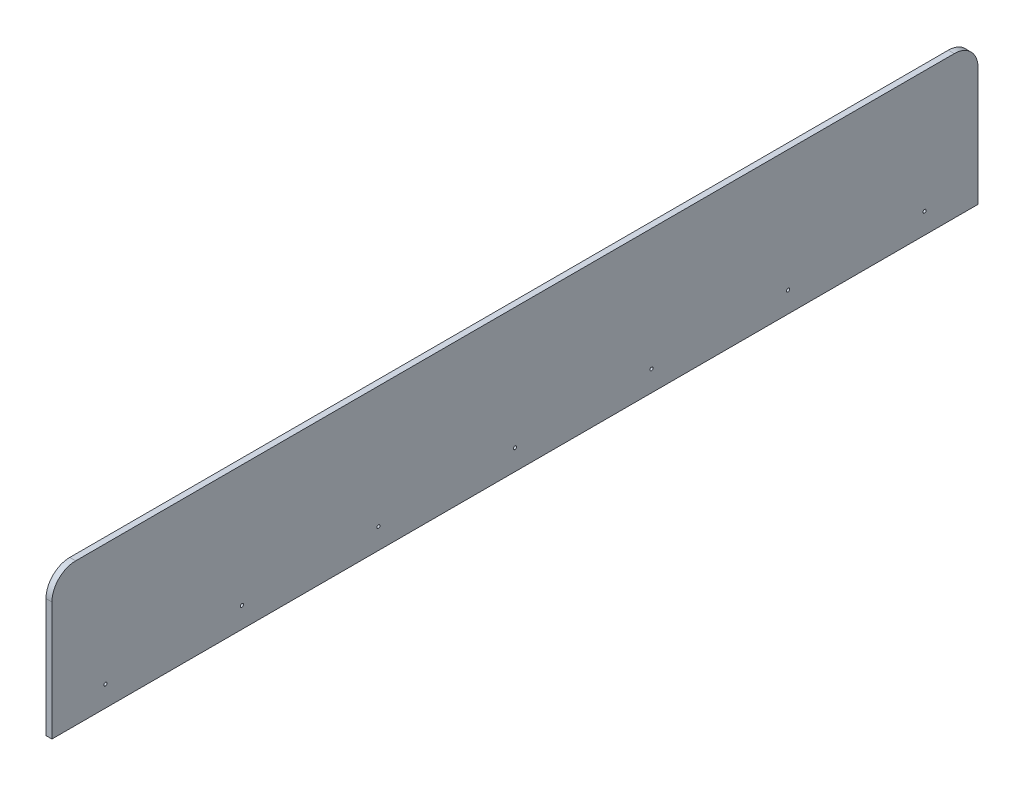
ISO-10303-21;
HEADER;
FILE_DESCRIPTION(('STEP AP214'),'2;1');
FILE_NAME('part.step','',(''),(''),'','','');
FILE_SCHEMA(('AUTOMOTIVE_DESIGN { 1 0 10303 214 1 1 1 1 }'));
ENDSEC;
DATA;
#1=APPLICATION_CONTEXT('core data for automotive mechanical design processes');
#2=APPLICATION_PROTOCOL_DEFINITION('international standard','automotive_design',2000,#1);
#3=PRODUCT_CONTEXT('',#1,'mechanical');
#4=PRODUCT('Part','Part','',(#3));
#5=PRODUCT_RELATED_PRODUCT_CATEGORY('part','',(#4));
#6=PRODUCT_DEFINITION_FORMATION('','',#4);
#7=PRODUCT_DEFINITION_CONTEXT('part definition',#1,'design');
#8=PRODUCT_DEFINITION('design','',#6,#7);
#9=PRODUCT_DEFINITION_SHAPE('','',#8);
#10=(LENGTH_UNIT() NAMED_UNIT(*) SI_UNIT(.MILLI.,.METRE.));
#11=(NAMED_UNIT(*) PLANE_ANGLE_UNIT() SI_UNIT($,.RADIAN.));
#12=(NAMED_UNIT(*) SI_UNIT($,.STERADIAN.) SOLID_ANGLE_UNIT());
#13=UNCERTAINTY_MEASURE_WITH_UNIT(LENGTH_MEASURE(1.E-05),#10,'distance_accuracy_value','');
#14=(GEOMETRIC_REPRESENTATION_CONTEXT(3) GLOBAL_UNCERTAINTY_ASSIGNED_CONTEXT((#13)) GLOBAL_UNIT_ASSIGNED_CONTEXT((#10,
#11,#12)) REPRESENTATION_CONTEXT('',''));
#15=CARTESIAN_POINT('',(0.,0.,0.));
#16=DIRECTION('',(0.,0.,1.));
#17=DIRECTION('',(1.,0.,0.));
#18=AXIS2_PLACEMENT_3D('',#15,#16,#17);
#19=CARTESIAN_POINT('',(12.7,101.6,939.8));
#20=DIRECTION('',(1.,0.,0.));
#21=DIRECTION('',(0.,0.,-1.));
#22=AXIS2_PLACEMENT_3D('',#19,#20,#21);
#23=PLANE('',#22);
#24=CARTESIAN_POINT('',(12.7,-107.95,-584.2));
#25=DIRECTION('',(1.,0.,0.));
#26=DIRECTION('',(0.,0.,-1.));
#27=AXIS2_PLACEMENT_3D('',#24,#25,#26);
#28=CIRCLE('',#27,3.37343749999992);
#29=CARTESIAN_POINT('',(12.7,-107.95,-587.5734375));
#30=VERTEX_POINT('',#29);
#31=EDGE_CURVE('E209',#30,#30,#28,.T.);
#32=ORIENTED_EDGE('',*,*,#31,.F.);
#33=EDGE_LOOP('',(#32));
#34=FACE_BOUND('',#33,.T.);
#35=CARTESIAN_POINT('',(12.7,-107.95,1.11022302462516E-13));
#36=DIRECTION('',(1.,0.,0.));
#37=DIRECTION('',(0.,0.,-1.));
#38=AXIS2_PLACEMENT_3D('',#35,#36,#37);
#39=CIRCLE('',#38,3.37343749999992);
#40=CARTESIAN_POINT('',(12.7,-107.95,-3.37343749999981));
#41=VERTEX_POINT('',#40);
#42=EDGE_CURVE('E221',#41,#41,#39,.T.);
#43=ORIENTED_EDGE('',*,*,#42,.F.);
#44=EDGE_LOOP('',(#43));
#45=FACE_BOUND('',#44,.T.);
#46=CARTESIAN_POINT('',(12.7,-107.95,584.2));
#47=DIRECTION('',(1.,0.,0.));
#48=DIRECTION('',(0.,0.,-1.));
#49=AXIS2_PLACEMENT_3D('',#46,#47,#48);
#50=CIRCLE('',#49,3.37343749999992);
#51=CARTESIAN_POINT('',(12.7,-107.95,580.8265625));
#52=VERTEX_POINT('',#51);
#53=EDGE_CURVE('E233',#52,#52,#50,.T.);
#54=ORIENTED_EDGE('',*,*,#53,.F.);
#55=EDGE_LOOP('',(#54));
#56=FACE_BOUND('',#55,.T.);
#57=DIRECTION('',(0.,-1.,0.));
#58=VECTOR('',#57,1.);
#59=CARTESIAN_POINT('',(12.7,-152.4,990.6));
#60=LINE('',#59,#58);
#61=CARTESIAN_POINT('',(12.7,101.6,990.6));
#62=VERTEX_POINT('',#61);
#63=CARTESIAN_POINT('',(12.7,-152.4,990.6));
#64=VERTEX_POINT('',#63);
#65=EDGE_CURVE('E137',#62,#64,#60,.T.);
#66=ORIENTED_EDGE('',*,*,#65,.T.);
#67=DIRECTION('',(0.,0.,-1.));
#68=VECTOR('',#67,1.);
#69=CARTESIAN_POINT('',(12.7,-152.4,990.6));
#70=LINE('',#69,#68);
#71=CARTESIAN_POINT('',(12.7,-152.4,-990.6));
#72=VERTEX_POINT('',#71);
#73=EDGE_CURVE('E95',#64,#72,#70,.T.);
#74=ORIENTED_EDGE('',*,*,#73,.T.);
#75=DIRECTION('',(0.,1.,0.));
#76=VECTOR('',#75,1.);
#77=CARTESIAN_POINT('',(12.7,-152.4,-990.6));
#78=LINE('',#77,#76);
#79=CARTESIAN_POINT('',(12.7,101.6,-990.6));
#80=VERTEX_POINT('',#79);
#81=EDGE_CURVE('E108',#72,#80,#78,.T.);
#82=ORIENTED_EDGE('',*,*,#81,.T.);
#83=CARTESIAN_POINT('',(12.7,101.6,-939.799999999999));
#84=DIRECTION('',(1.,0.,0.));
#85=DIRECTION('',(0.,0.,1.));
#86=AXIS2_PLACEMENT_3D('',#83,#84,#85);
#87=CIRCLE('',#86,50.8);
#88=CARTESIAN_POINT('',(12.7,152.4,-939.799999999999));
#89=VERTEX_POINT('',#88);
#90=EDGE_CURVE('E102',#80,#89,#87,.T.);
#91=ORIENTED_EDGE('',*,*,#90,.T.);
#92=DIRECTION('',(0.,0.,1.));
#93=VECTOR('',#92,1.);
#94=CARTESIAN_POINT('',(12.7,152.4,939.799999999999));
#95=LINE('',#94,#93);
#96=CARTESIAN_POINT('',(12.7,152.4,939.799999999999));
#97=VERTEX_POINT('',#96);
#98=EDGE_CURVE('E106',#89,#97,#95,.T.);
#99=ORIENTED_EDGE('',*,*,#98,.T.);
#100=CARTESIAN_POINT('',(12.7,101.6,939.8));
#101=DIRECTION('',(1.,0.,0.));
#102=DIRECTION('',(0.,0.,-1.));
#103=AXIS2_PLACEMENT_3D('',#100,#101,#102);
#104=CIRCLE('',#103,50.8);
#105=EDGE_CURVE('E58',#97,#62,#104,.T.);
#106=ORIENTED_EDGE('',*,*,#105,.T.);
#107=EDGE_LOOP('',(#66,#74,#82,#91,#99,#106));
#108=FACE_BOUND('',#107,.T.);
#109=CARTESIAN_POINT('',(12.7,-107.95,876.3));
#110=DIRECTION('',(1.,0.,0.));
#111=DIRECTION('',(0.,0.,-1.));
#112=AXIS2_PLACEMENT_3D('',#109,#110,#111);
#113=CIRCLE('',#112,3.37343749999992);
#114=CARTESIAN_POINT('',(12.7,-107.95,872.9265625));
#115=VERTEX_POINT('',#114);
#116=EDGE_CURVE('E130',#115,#115,#113,.T.);
#117=ORIENTED_EDGE('',*,*,#116,.F.);
#118=EDGE_LOOP('',(#117));
#119=FACE_BOUND('',#118,.T.);
#120=CARTESIAN_POINT('',(12.7,-107.95,292.1));
#121=DIRECTION('',(1.,0.,0.));
#122=DIRECTION('',(0.,0.,-1.));
#123=AXIS2_PLACEMENT_3D('',#120,#121,#122);
#124=CIRCLE('',#123,3.37343749999992);
#125=CARTESIAN_POINT('',(12.7,-107.95,288.7265625));
#126=VERTEX_POINT('',#125);
#127=EDGE_CURVE('E227',#126,#126,#124,.T.);
#128=ORIENTED_EDGE('',*,*,#127,.F.);
#129=EDGE_LOOP('',(#128));
#130=FACE_BOUND('',#129,.T.);
#131=CARTESIAN_POINT('',(12.7,-107.95,-292.1));
#132=DIRECTION('',(1.,0.,0.));
#133=DIRECTION('',(0.,0.,-1.));
#134=AXIS2_PLACEMENT_3D('',#131,#132,#133);
#135=CIRCLE('',#134,3.37343749999992);
#136=CARTESIAN_POINT('',(12.7,-107.95,-295.4734375));
#137=VERTEX_POINT('',#136);
#138=EDGE_CURVE('E215',#137,#137,#135,.T.);
#139=ORIENTED_EDGE('',*,*,#138,.F.);
#140=EDGE_LOOP('',(#139));
#141=FACE_BOUND('',#140,.T.);
#142=CARTESIAN_POINT('',(12.7,-107.95,-876.3));
#143=DIRECTION('',(1.,0.,0.));
#144=DIRECTION('',(0.,0.,-1.));
#145=AXIS2_PLACEMENT_3D('',#142,#143,#144);
#146=CIRCLE('',#145,3.37343749999992);
#147=CARTESIAN_POINT('',(12.7,-107.95,-879.6734375));
#148=VERTEX_POINT('',#147);
#149=EDGE_CURVE('E200',#148,#148,#146,.T.);
#150=ORIENTED_EDGE('',*,*,#149,.F.);
#151=EDGE_LOOP('',(#150));
#152=FACE_BOUND('',#151,.T.);
#153=ADVANCED_FACE('F41',(#34,#45,#56,#108,#119,#130,#141,#152),#23,.T.);
#154=CARTESIAN_POINT('',(0.,101.6,939.8));
#155=DIRECTION('',(1.,0.,0.));
#156=DIRECTION('',(0.,0.,-1.));
#157=AXIS2_PLACEMENT_3D('',#154,#155,#156);
#158=PLANE('',#157);
#159=DIRECTION('',(0.,-1.,0.));
#160=VECTOR('',#159,1.);
#161=CARTESIAN_POINT('',(0.,-152.4,990.6));
#162=LINE('',#161,#160);
#163=CARTESIAN_POINT('',(0.,101.6,990.6));
#164=VERTEX_POINT('',#163);
#165=CARTESIAN_POINT('',(0.,-152.4,990.6));
#166=VERTEX_POINT('',#165);
#167=EDGE_CURVE('E126',#164,#166,#162,.T.);
#168=ORIENTED_EDGE('',*,*,#167,.F.);
#169=CARTESIAN_POINT('',(0.,101.6,939.8));
#170=DIRECTION('',(1.,0.,0.));
#171=DIRECTION('',(0.,0.,-1.));
#172=AXIS2_PLACEMENT_3D('',#169,#170,#171);
#173=CIRCLE('',#172,50.8);
#174=CARTESIAN_POINT('',(0.,152.4,939.799999999999));
#175=VERTEX_POINT('',#174);
#176=EDGE_CURVE('E87',#175,#164,#173,.T.);
#177=ORIENTED_EDGE('',*,*,#176,.F.);
#178=DIRECTION('',(0.,0.,1.));
#179=VECTOR('',#178,1.);
#180=CARTESIAN_POINT('',(0.,152.4,939.799999999999));
#181=LINE('',#180,#179);
#182=CARTESIAN_POINT('',(0.,152.4,-939.799999999999));
#183=VERTEX_POINT('',#182);
#184=EDGE_CURVE('E81',#183,#175,#181,.T.);
#185=ORIENTED_EDGE('',*,*,#184,.F.);
#186=CARTESIAN_POINT('',(0.,101.6,-939.799999999999));
#187=DIRECTION('',(1.,0.,0.));
#188=DIRECTION('',(0.,0.,1.));
#189=AXIS2_PLACEMENT_3D('',#186,#187,#188);
#190=CIRCLE('',#189,50.8);
#191=CARTESIAN_POINT('',(0.,101.6,-990.6));
#192=VERTEX_POINT('',#191);
#193=EDGE_CURVE('E116',#192,#183,#190,.T.);
#194=ORIENTED_EDGE('',*,*,#193,.F.);
#195=DIRECTION('',(0.,1.,0.));
#196=VECTOR('',#195,1.);
#197=CARTESIAN_POINT('',(0.,-152.4,-990.6));
#198=LINE('',#197,#196);
#199=CARTESIAN_POINT('',(0.,-152.4,-990.6));
#200=VERTEX_POINT('',#199);
#201=EDGE_CURVE('E132',#200,#192,#198,.T.);
#202=ORIENTED_EDGE('',*,*,#201,.F.);
#203=DIRECTION('',(0.,0.,-1.));
#204=VECTOR('',#203,1.);
#205=CARTESIAN_POINT('',(0.,-152.4,990.6));
#206=LINE('',#205,#204);
#207=EDGE_CURVE('E129',#166,#200,#206,.T.);
#208=ORIENTED_EDGE('',*,*,#207,.F.);
#209=EDGE_LOOP('',(#168,#177,#185,#194,#202,#208));
#210=FACE_BOUND('',#209,.T.);
#211=CARTESIAN_POINT('',(0.,-107.95,876.3));
#212=DIRECTION('',(1.,0.,0.));
#213=DIRECTION('',(0.,0.,-1.));
#214=AXIS2_PLACEMENT_3D('',#211,#212,#213);
#215=CIRCLE('',#214,3.37343749999992);
#216=CARTESIAN_POINT('',(0.,-107.95,872.9265625));
#217=VERTEX_POINT('',#216);
#218=EDGE_CURVE('E236',#217,#217,#215,.T.);
#219=ORIENTED_EDGE('',*,*,#218,.T.);
#220=EDGE_LOOP('',(#219));
#221=FACE_BOUND('',#220,.T.);
#222=CARTESIAN_POINT('',(0.,-107.95,584.2));
#223=DIRECTION('',(1.,0.,0.));
#224=DIRECTION('',(0.,0.,-1.));
#225=AXIS2_PLACEMENT_3D('',#222,#223,#224);
#226=CIRCLE('',#225,3.37343749999992);
#227=CARTESIAN_POINT('',(0.,-107.95,580.8265625));
#228=VERTEX_POINT('',#227);
#229=EDGE_CURVE('E230',#228,#228,#226,.T.);
#230=ORIENTED_EDGE('',*,*,#229,.T.);
#231=EDGE_LOOP('',(#230));
#232=FACE_BOUND('',#231,.T.);
#233=CARTESIAN_POINT('',(0.,-107.95,292.1));
#234=DIRECTION('',(1.,0.,0.));
#235=DIRECTION('',(0.,0.,-1.));
#236=AXIS2_PLACEMENT_3D('',#233,#234,#235);
#237=CIRCLE('',#236,3.37343749999992);
#238=CARTESIAN_POINT('',(0.,-107.95,288.7265625));
#239=VERTEX_POINT('',#238);
#240=EDGE_CURVE('E224',#239,#239,#237,.T.);
#241=ORIENTED_EDGE('',*,*,#240,.T.);
#242=EDGE_LOOP('',(#241));
#243=FACE_BOUND('',#242,.T.);
#244=CARTESIAN_POINT('',(0.,-107.95,1.11022302462516E-13));
#245=DIRECTION('',(1.,0.,0.));
#246=DIRECTION('',(0.,0.,-1.));
#247=AXIS2_PLACEMENT_3D('',#244,#245,#246);
#248=CIRCLE('',#247,3.37343749999992);
#249=CARTESIAN_POINT('',(0.,-107.95,-3.37343749999981));
#250=VERTEX_POINT('',#249);
#251=EDGE_CURVE('E218',#250,#250,#248,.T.);
#252=ORIENTED_EDGE('',*,*,#251,.T.);
#253=EDGE_LOOP('',(#252));
#254=FACE_BOUND('',#253,.T.);
#255=CARTESIAN_POINT('',(0.,-107.95,-292.1));
#256=DIRECTION('',(1.,0.,0.));
#257=DIRECTION('',(0.,0.,-1.));
#258=AXIS2_PLACEMENT_3D('',#255,#256,#257);
#259=CIRCLE('',#258,3.37343749999992);
#260=CARTESIAN_POINT('',(0.,-107.95,-295.4734375));
#261=VERTEX_POINT('',#260);
#262=EDGE_CURVE('E212',#261,#261,#259,.T.);
#263=ORIENTED_EDGE('',*,*,#262,.T.);
#264=EDGE_LOOP('',(#263));
#265=FACE_BOUND('',#264,.T.);
#266=CARTESIAN_POINT('',(0.,-107.95,-584.2));
#267=DIRECTION('',(1.,0.,0.));
#268=DIRECTION('',(0.,0.,-1.));
#269=AXIS2_PLACEMENT_3D('',#266,#267,#268);
#270=CIRCLE('',#269,3.37343749999992);
#271=CARTESIAN_POINT('',(0.,-107.95,-587.5734375));
#272=VERTEX_POINT('',#271);
#273=EDGE_CURVE('E206',#272,#272,#270,.T.);
#274=ORIENTED_EDGE('',*,*,#273,.T.);
#275=EDGE_LOOP('',(#274));
#276=FACE_BOUND('',#275,.T.);
#277=CARTESIAN_POINT('',(0.,-107.95,-876.3));
#278=DIRECTION('',(1.,0.,0.));
#279=DIRECTION('',(0.,0.,-1.));
#280=AXIS2_PLACEMENT_3D('',#277,#278,#279);
#281=CIRCLE('',#280,3.37343749999992);
#282=CARTESIAN_POINT('',(0.,-107.95,-879.6734375));
#283=VERTEX_POINT('',#282);
#284=EDGE_CURVE('E203',#283,#283,#281,.T.);
#285=ORIENTED_EDGE('',*,*,#284,.T.);
#286=EDGE_LOOP('',(#285));
#287=FACE_BOUND('',#286,.T.);
#288=ADVANCED_FACE('F146',(#210,#221,#232,#243,#254,#265,#276,#287),#158,.F.);
#289=CARTESIAN_POINT('',(12.7,-152.4,990.6));
#290=DIRECTION('',(0.,0.,-1.));
#291=DIRECTION('',(-1.,0.,0.));
#292=AXIS2_PLACEMENT_3D('',#289,#290,#291);
#293=PLANE('',#292);
#294=ORIENTED_EDGE('',*,*,#167,.T.);
#295=DIRECTION('',(-1.,0.,0.));
#296=VECTOR('',#295,1.);
#297=CARTESIAN_POINT('',(12.7,-152.4,990.6));
#298=LINE('',#297,#296);
#299=EDGE_CURVE('E13',#64,#166,#298,.T.);
#300=ORIENTED_EDGE('',*,*,#299,.F.);
#301=ORIENTED_EDGE('',*,*,#65,.F.);
#302=DIRECTION('',(-1.,0.,0.));
#303=VECTOR('',#302,1.);
#304=CARTESIAN_POINT('',(12.7,101.6,990.6));
#305=LINE('',#304,#303);
#306=EDGE_CURVE('E122',#62,#164,#305,.T.);
#307=ORIENTED_EDGE('',*,*,#306,.T.);
#308=EDGE_LOOP('',(#294,#300,#301,#307));
#309=FACE_BOUND('',#308,.T.);
#310=ADVANCED_FACE('F43',(#309),#293,.F.);
#311=CARTESIAN_POINT('',(12.7,-152.4,990.6));
#312=DIRECTION('',(0.,1.,0.));
#313=DIRECTION('',(0.,0.,1.));
#314=AXIS2_PLACEMENT_3D('',#311,#312,#313);
#315=PLANE('',#314);
#316=ORIENTED_EDGE('',*,*,#207,.T.);
#317=DIRECTION('',(-1.,0.,0.));
#318=VECTOR('',#317,1.);
#319=CARTESIAN_POINT('',(12.7,-152.4,-990.6));
#320=LINE('',#319,#318);
#321=EDGE_CURVE('E50',#72,#200,#320,.T.);
#322=ORIENTED_EDGE('',*,*,#321,.F.);
#323=ORIENTED_EDGE('',*,*,#73,.F.);
#324=ORIENTED_EDGE('',*,*,#299,.T.);
#325=EDGE_LOOP('',(#316,#322,#323,#324));
#326=FACE_BOUND('',#325,.T.);
#327=ADVANCED_FACE('F321',(#326),#315,.F.);
#328=CARTESIAN_POINT('',(12.7,-152.4,-990.6));
#329=DIRECTION('',(0.,0.,1.));
#330=DIRECTION('',(0.,-1.,0.));
#331=AXIS2_PLACEMENT_3D('',#328,#329,#330);
#332=PLANE('',#331);
#333=ORIENTED_EDGE('',*,*,#201,.T.);
#334=DIRECTION('',(-1.,0.,0.));
#335=VECTOR('',#334,1.);
#336=CARTESIAN_POINT('',(12.7,101.6,-990.6));
#337=LINE('',#336,#335);
#338=EDGE_CURVE('E117',#80,#192,#337,.T.);
#339=ORIENTED_EDGE('',*,*,#338,.F.);
#340=ORIENTED_EDGE('',*,*,#81,.F.);
#341=ORIENTED_EDGE('',*,*,#321,.T.);
#342=EDGE_LOOP('',(#333,#339,#340,#341));
#343=FACE_BOUND('',#342,.T.);
#344=ADVANCED_FACE('F143',(#343),#332,.F.);
#345=CARTESIAN_POINT('',(12.7,101.6,-939.799999999999));
#346=DIRECTION('',(-1.,0.,0.));
#347=DIRECTION('',(0.,0.,1.));
#348=AXIS2_PLACEMENT_3D('',#345,#346,#347);
#349=CYLINDRICAL_SURFACE('',#348,50.8);
#350=ORIENTED_EDGE('',*,*,#193,.T.);
#351=DIRECTION('',(-1.,0.,0.));
#352=VECTOR('',#351,1.);
#353=CARTESIAN_POINT('',(12.7,152.4,-939.799999999999));
#354=LINE('',#353,#352);
#355=EDGE_CURVE('E113',#89,#183,#354,.T.);
#356=ORIENTED_EDGE('',*,*,#355,.F.);
#357=ORIENTED_EDGE('',*,*,#90,.F.);
#358=ORIENTED_EDGE('',*,*,#338,.T.);
#359=EDGE_LOOP('',(#350,#356,#357,#358));
#360=FACE_BOUND('',#359,.T.);
#361=ADVANCED_FACE('F114',(#360),#349,.T.);
#362=CARTESIAN_POINT('',(12.7,152.4,939.799999999999));
#363=DIRECTION('',(0.,-1.,0.));
#364=DIRECTION('',(0.,0.,-1.));
#365=AXIS2_PLACEMENT_3D('',#362,#363,#364);
#366=PLANE('',#365);
#367=ORIENTED_EDGE('',*,*,#184,.T.);
#368=DIRECTION('',(-1.,0.,0.));
#369=VECTOR('',#368,1.);
#370=CARTESIAN_POINT('',(12.7,152.4,939.799999999999));
#371=LINE('',#370,#369);
#372=EDGE_CURVE('E118',#97,#175,#371,.T.);
#373=ORIENTED_EDGE('',*,*,#372,.F.);
#374=ORIENTED_EDGE('',*,*,#98,.F.);
#375=ORIENTED_EDGE('',*,*,#355,.T.);
#376=EDGE_LOOP('',(#367,#373,#374,#375));
#377=FACE_BOUND('',#376,.T.);
#378=ADVANCED_FACE('F120',(#377),#366,.F.);
#379=CARTESIAN_POINT('',(12.7,101.6,939.8));
#380=DIRECTION('',(-1.,0.,0.));
#381=DIRECTION('',(0.,0.,1.));
#382=AXIS2_PLACEMENT_3D('',#379,#380,#381);
#383=CYLINDRICAL_SURFACE('',#382,50.8);
#384=ORIENTED_EDGE('',*,*,#176,.T.);
#385=ORIENTED_EDGE('',*,*,#306,.F.);
#386=ORIENTED_EDGE('',*,*,#105,.F.);
#387=ORIENTED_EDGE('',*,*,#372,.T.);
#388=EDGE_LOOP('',(#384,#385,#386,#387));
#389=FACE_BOUND('',#388,.T.);
#390=ADVANCED_FACE('F151',(#389),#383,.T.);
#391=CARTESIAN_POINT('',(12.7,-107.95,876.3));
#392=DIRECTION('',(-1.,0.,0.));
#393=DIRECTION('',(0.,0.,1.));
#394=AXIS2_PLACEMENT_3D('',#391,#392,#393);
#395=CYLINDRICAL_SURFACE('',#394,3.37343749999992);
#396=ORIENTED_EDGE('',*,*,#116,.T.);
#397=EDGE_LOOP('',(#396));
#398=FACE_BOUND('',#397,.T.);
#399=ORIENTED_EDGE('',*,*,#218,.F.);
#400=EDGE_LOOP('',(#399));
#401=FACE_BOUND('',#400,.T.);
#402=ADVANCED_FACE('F153',(#398,#401),#395,.F.);
#403=CARTESIAN_POINT('',(12.7,-107.95,584.2));
#404=DIRECTION('',(-1.,0.,0.));
#405=DIRECTION('',(0.,0.,1.));
#406=AXIS2_PLACEMENT_3D('',#403,#404,#405);
#407=CYLINDRICAL_SURFACE('',#406,3.37343749999992);
#408=ORIENTED_EDGE('',*,*,#53,.T.);
#409=EDGE_LOOP('',(#408));
#410=FACE_BOUND('',#409,.T.);
#411=ORIENTED_EDGE('',*,*,#229,.F.);
#412=EDGE_LOOP('',(#411));
#413=FACE_BOUND('',#412,.T.);
#414=ADVANCED_FACE('F159',(#410,#413),#407,.F.);
#415=CARTESIAN_POINT('',(12.7,-107.95,292.1));
#416=DIRECTION('',(-1.,0.,0.));
#417=DIRECTION('',(0.,0.,1.));
#418=AXIS2_PLACEMENT_3D('',#415,#416,#417);
#419=CYLINDRICAL_SURFACE('',#418,3.37343749999992);
#420=ORIENTED_EDGE('',*,*,#127,.T.);
#421=EDGE_LOOP('',(#420));
#422=FACE_BOUND('',#421,.T.);
#423=ORIENTED_EDGE('',*,*,#240,.F.);
#424=EDGE_LOOP('',(#423));
#425=FACE_BOUND('',#424,.T.);
#426=ADVANCED_FACE('F175',(#422,#425),#419,.F.);
#427=CARTESIAN_POINT('',(12.7,-107.95,1.11022302462516E-13));
#428=DIRECTION('',(-1.,0.,0.));
#429=DIRECTION('',(0.,0.,1.));
#430=AXIS2_PLACEMENT_3D('',#427,#428,#429);
#431=CYLINDRICAL_SURFACE('',#430,3.37343749999992);
#432=ORIENTED_EDGE('',*,*,#42,.T.);
#433=EDGE_LOOP('',(#432));
#434=FACE_BOUND('',#433,.T.);
#435=ORIENTED_EDGE('',*,*,#251,.F.);
#436=EDGE_LOOP('',(#435));
#437=FACE_BOUND('',#436,.T.);
#438=ADVANCED_FACE('F179',(#434,#437),#431,.F.);
#439=CARTESIAN_POINT('',(12.7,-107.95,-292.1));
#440=DIRECTION('',(-1.,0.,0.));
#441=DIRECTION('',(0.,0.,1.));
#442=AXIS2_PLACEMENT_3D('',#439,#440,#441);
#443=CYLINDRICAL_SURFACE('',#442,3.37343749999992);
#444=ORIENTED_EDGE('',*,*,#138,.T.);
#445=EDGE_LOOP('',(#444));
#446=FACE_BOUND('',#445,.T.);
#447=ORIENTED_EDGE('',*,*,#262,.F.);
#448=EDGE_LOOP('',(#447));
#449=FACE_BOUND('',#448,.T.);
#450=ADVANCED_FACE('F183',(#446,#449),#443,.F.);
#451=CARTESIAN_POINT('',(12.7,-107.95,-584.2));
#452=DIRECTION('',(-1.,0.,0.));
#453=DIRECTION('',(0.,0.,1.));
#454=AXIS2_PLACEMENT_3D('',#451,#452,#453);
#455=CYLINDRICAL_SURFACE('',#454,3.37343749999992);
#456=ORIENTED_EDGE('',*,*,#31,.T.);
#457=EDGE_LOOP('',(#456));
#458=FACE_BOUND('',#457,.T.);
#459=ORIENTED_EDGE('',*,*,#273,.F.);
#460=EDGE_LOOP('',(#459));
#461=FACE_BOUND('',#460,.T.);
#462=ADVANCED_FACE('F187',(#458,#461),#455,.F.);
#463=CARTESIAN_POINT('',(12.7,-107.95,-876.3));
#464=DIRECTION('',(-1.,0.,0.));
#465=DIRECTION('',(0.,0.,1.));
#466=AXIS2_PLACEMENT_3D('',#463,#464,#465);
#467=CYLINDRICAL_SURFACE('',#466,3.37343749999992);
#468=ORIENTED_EDGE('',*,*,#149,.T.);
#469=EDGE_LOOP('',(#468));
#470=FACE_BOUND('',#469,.T.);
#471=ORIENTED_EDGE('',*,*,#284,.F.);
#472=EDGE_LOOP('',(#471));
#473=FACE_BOUND('',#472,.T.);
#474=ADVANCED_FACE('F191',(#470,#473),#467,.F.);
#475=CLOSED_SHELL('',(#153,#288,#310,#327,#344,#361,#378,#390,#402,#414,#426,#438,#450,#462,#474));
#476=MANIFOLD_SOLID_BREP('B2',#475);
#477=ADVANCED_BREP_SHAPE_REPRESENTATION('',(#18,#476),#14);
#478=SHAPE_DEFINITION_REPRESENTATION(#9,#477);
ENDSEC;
END-ISO-10303-21;
